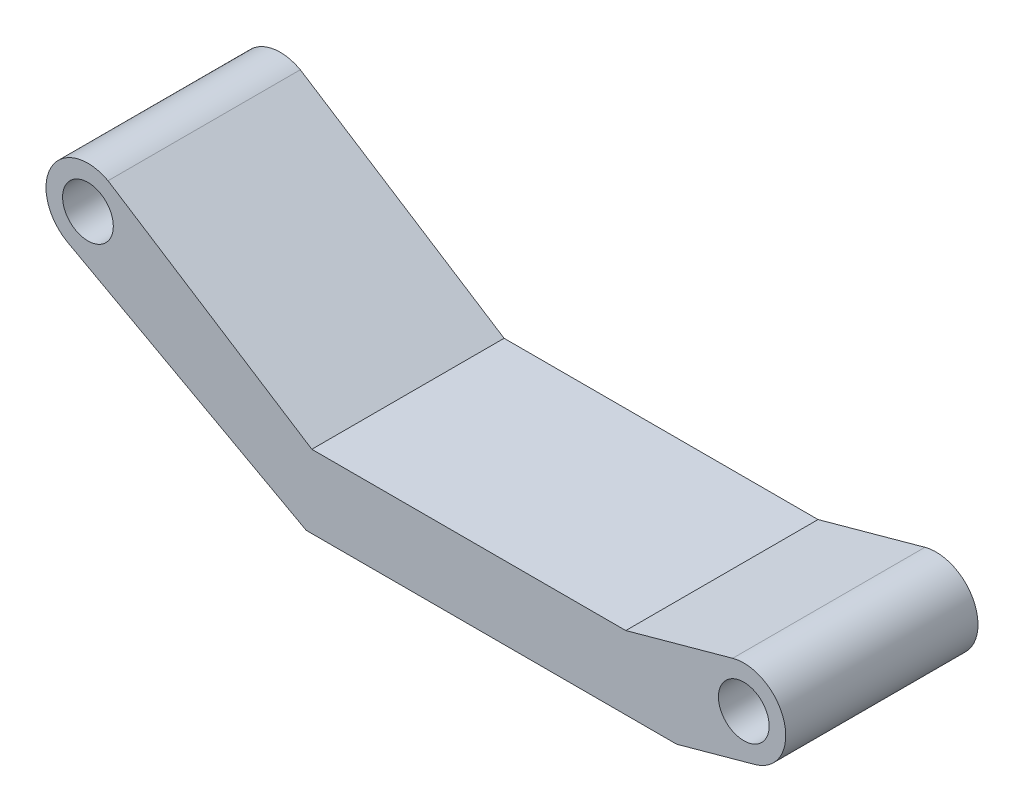
ISO-10303-21;
HEADER;
FILE_DESCRIPTION(('STEP AP214'),'2;1');
FILE_NAME('part.step','',(''),(''),'','','');
FILE_SCHEMA(('AUTOMOTIVE_DESIGN { 1 0 10303 214 1 1 1 1 }'));
ENDSEC;
DATA;
#1=APPLICATION_CONTEXT('core data for automotive mechanical design processes');
#2=APPLICATION_PROTOCOL_DEFINITION('international standard','automotive_design',2000,#1);
#3=PRODUCT_CONTEXT('',#1,'mechanical');
#4=PRODUCT('Part','Part','',(#3));
#5=PRODUCT_RELATED_PRODUCT_CATEGORY('part','',(#4));
#6=PRODUCT_DEFINITION_FORMATION('','',#4);
#7=PRODUCT_DEFINITION_CONTEXT('part definition',#1,'design');
#8=PRODUCT_DEFINITION('design','',#6,#7);
#9=PRODUCT_DEFINITION_SHAPE('','',#8);
#10=(LENGTH_UNIT() NAMED_UNIT(*) SI_UNIT(.MILLI.,.METRE.));
#11=(NAMED_UNIT(*) PLANE_ANGLE_UNIT() SI_UNIT($,.RADIAN.));
#12=(NAMED_UNIT(*) SI_UNIT($,.STERADIAN.) SOLID_ANGLE_UNIT());
#13=UNCERTAINTY_MEASURE_WITH_UNIT(LENGTH_MEASURE(1.E-05),#10,'distance_accuracy_value','');
#14=(GEOMETRIC_REPRESENTATION_CONTEXT(3) GLOBAL_UNCERTAINTY_ASSIGNED_CONTEXT((#13)) GLOBAL_UNIT_ASSIGNED_CONTEXT((#10,
#11,#12)) REPRESENTATION_CONTEXT('',''));
#15=CARTESIAN_POINT('',(0.,0.,0.));
#16=DIRECTION('',(0.,0.,1.));
#17=DIRECTION('',(1.,0.,0.));
#18=AXIS2_PLACEMENT_3D('',#15,#16,#17);
#19=CARTESIAN_POINT('',(-123.808315196469,15.,27.5));
#20=DIRECTION('',(0.,0.,1.));
#21=DIRECTION('',(1.,0.,0.));
#22=AXIS2_PLACEMENT_3D('',#19,#20,#21);
#23=PLANE('',#22);
#24=CARTESIAN_POINT('',(-123.808315196469,15.,27.5));
#25=DIRECTION('',(0.,0.,1.));
#26=DIRECTION('',(1.,0.,0.));
#27=AXIS2_PLACEMENT_3D('',#24,#25,#26);
#28=CIRCLE('',#27,3.62850408907859);
#29=CARTESIAN_POINT('',(-120.17981110739,15.,27.5));
#30=VERTEX_POINT('',#29);
#31=EDGE_CURVE('E142',#30,#30,#28,.T.);
#32=ORIENTED_EDGE('',*,*,#31,.F.);
#33=EDGE_LOOP('',(#32));
#34=FACE_BOUND('',#33,.T.);
#35=CARTESIAN_POINT('',(-123.808315196469,15.,27.5));
#36=DIRECTION('',(0.,0.,1.));
#37=DIRECTION('',(1.,0.,0.));
#38=AXIS2_PLACEMENT_3D('',#35,#36,#37);
#39=CIRCLE('',#38,6.);
#40=CARTESIAN_POINT('',(-120.934685686301,20.2670915540072,27.5));
#41=VERTEX_POINT('',#40);
#42=CARTESIAN_POINT('',(-126.681944706636,9.73290844599282,27.5));
#43=VERTEX_POINT('',#42);
#44=EDGE_CURVE('E153',#41,#43,#39,.T.);
#45=ORIENTED_EDGE('',*,*,#44,.T.);
#46=DIRECTION('',(0.877848592334531,-0.478938251694602,0.));
#47=VECTOR('',#46,1.);
#48=CARTESIAN_POINT('',(-126.681944706636,9.73290844599282,27.5));
#49=LINE('',#48,#47);
#50=CARTESIAN_POINT('',(-92.5887882431829,-8.86769864495569,27.5));
#51=VERTEX_POINT('',#50);
#52=EDGE_CURVE('E101',#43,#51,#49,.T.);
#53=ORIENTED_EDGE('',*,*,#52,.T.);
#54=DIRECTION('',(1.,0.,0.));
#55=VECTOR('',#54,1.);
#56=CARTESIAN_POINT('',(-92.5887882431829,-8.86769864495569,27.5));
#57=LINE('',#56,#55);
#58=CARTESIAN_POINT('',(-39.6075574443592,-8.86769864495569,27.5));
#59=VERTEX_POINT('',#58);
#60=EDGE_CURVE('E168',#51,#59,#57,.T.);
#61=ORIENTED_EDGE('',*,*,#60,.T.);
#62=DIRECTION('',(0.964141980080619,0.265386966986369,0.));
#63=VECTOR('',#62,1.);
#64=CARTESIAN_POINT('',(-39.6075574443592,-8.86769864495569,27.5));
#65=LINE('',#64,#63);
#66=CARTESIAN_POINT('',(-28.4076781980818,-5.78485188048372,27.5));
#67=VERTEX_POINT('',#66);
#68=EDGE_CURVE('E181',#59,#67,#65,.T.);
#69=ORIENTED_EDGE('',*,*,#68,.T.);
#70=CARTESIAN_POINT('',(-30.,0.,27.5));
#71=DIRECTION('',(0.,0.,1.));
#72=DIRECTION('',(1.,0.,0.));
#73=AXIS2_PLACEMENT_3D('',#70,#71,#72);
#74=CIRCLE('',#73,6.);
#75=CARTESIAN_POINT('',(-31.5923218019182,5.78485188048371,27.5));
#76=VERTEX_POINT('',#75);
#77=EDGE_CURVE('E120',#67,#76,#74,.T.);
#78=ORIENTED_EDGE('',*,*,#77,.T.);
#79=DIRECTION('',(-0.964141980080619,-0.265386966986369,0.));
#80=VECTOR('',#79,1.);
#81=CARTESIAN_POINT('',(-46.8797014578034,1.57689143081505,27.5));
#82=LINE('',#81,#80);
#83=CARTESIAN_POINT('',(-46.8797014578034,1.57689143081505,27.5));
#84=VERTEX_POINT('',#83);
#85=EDGE_CURVE('E114',#76,#84,#82,.T.);
#86=ORIENTED_EDGE('',*,*,#85,.T.);
#87=DIRECTION('',(-1.,0.,0.));
#88=VECTOR('',#87,1.);
#89=CARTESIAN_POINT('',(-91.7850438779108,1.57689143081505,27.5));
#90=LINE('',#89,#88);
#91=CARTESIAN_POINT('',(-91.7850438779108,1.57689143081505,27.5));
#92=VERTEX_POINT('',#91);
#93=EDGE_CURVE('E118',#84,#92,#90,.T.);
#94=ORIENTED_EDGE('',*,*,#93,.T.);
#95=DIRECTION('',(-0.841819666427667,0.539758880626906,0.));
#96=VECTOR('',#95,1.);
#97=CARTESIAN_POINT('',(-120.934685686301,20.2670915540072,27.5));
#98=LINE('',#97,#96);
#99=EDGE_CURVE('E58',#92,#41,#98,.T.);
#100=ORIENTED_EDGE('',*,*,#99,.T.);
#101=EDGE_LOOP('',(#45,#53,#61,#69,#78,#86,#94,#100));
#102=FACE_BOUND('',#101,.T.);
#103=CARTESIAN_POINT('',(-30.,0.,27.5));
#104=DIRECTION('',(0.,0.,1.));
#105=DIRECTION('',(1.,0.,0.));
#106=AXIS2_PLACEMENT_3D('',#103,#104,#105);
#107=CIRCLE('',#106,3.62850408907859);
#108=CARTESIAN_POINT('',(-26.3714959109214,0.,27.5));
#109=VERTEX_POINT('',#108);
#110=EDGE_CURVE('E190',#109,#109,#107,.T.);
#111=ORIENTED_EDGE('',*,*,#110,.F.);
#112=EDGE_LOOP('',(#111));
#113=FACE_BOUND('',#112,.T.);
#114=ADVANCED_FACE('F41',(#34,#102,#113),#23,.T.);
#115=CARTESIAN_POINT('',(-123.808315196469,15.,0.));
#116=DIRECTION('',(0.,0.,1.));
#117=DIRECTION('',(1.,0.,0.));
#118=AXIS2_PLACEMENT_3D('',#115,#116,#117);
#119=PLANE('',#118);
#120=CARTESIAN_POINT('',(-123.808315196469,15.,0.));
#121=DIRECTION('',(0.,0.,1.));
#122=DIRECTION('',(1.,0.,0.));
#123=AXIS2_PLACEMENT_3D('',#120,#121,#122);
#124=CIRCLE('',#123,6.);
#125=CARTESIAN_POINT('',(-120.934685686301,20.2670915540072,0.));
#126=VERTEX_POINT('',#125);
#127=CARTESIAN_POINT('',(-126.681944706636,9.73290844599282,0.));
#128=VERTEX_POINT('',#127);
#129=EDGE_CURVE('E138',#126,#128,#124,.T.);
#130=ORIENTED_EDGE('',*,*,#129,.F.);
#131=DIRECTION('',(-0.841819666427667,0.539758880626906,0.));
#132=VECTOR('',#131,1.);
#133=CARTESIAN_POINT('',(-120.934685686301,20.2670915540072,0.));
#134=LINE('',#133,#132);
#135=CARTESIAN_POINT('',(-91.7850438779108,1.57689143081505,0.));
#136=VERTEX_POINT('',#135);
#137=EDGE_CURVE('E93',#136,#126,#134,.T.);
#138=ORIENTED_EDGE('',*,*,#137,.F.);
#139=DIRECTION('',(-1.,0.,0.));
#140=VECTOR('',#139,1.);
#141=CARTESIAN_POINT('',(-91.7850438779108,1.57689143081505,0.));
#142=LINE('',#141,#140);
#143=CARTESIAN_POINT('',(-46.8797014578034,1.57689143081505,0.));
#144=VERTEX_POINT('',#143);
#145=EDGE_CURVE('E87',#144,#136,#142,.T.);
#146=ORIENTED_EDGE('',*,*,#145,.F.);
#147=DIRECTION('',(-0.964141980080619,-0.265386966986369,0.));
#148=VECTOR('',#147,1.);
#149=CARTESIAN_POINT('',(-46.8797014578034,1.57689143081505,0.));
#150=LINE('',#149,#148);
#151=CARTESIAN_POINT('',(-31.5923218019182,5.78485188048371,0.));
#152=VERTEX_POINT('',#151);
#153=EDGE_CURVE('E128',#152,#144,#150,.T.);
#154=ORIENTED_EDGE('',*,*,#153,.F.);
#155=CARTESIAN_POINT('',(-30.,0.,0.));
#156=DIRECTION('',(0.,0.,1.));
#157=DIRECTION('',(1.,0.,0.));
#158=AXIS2_PLACEMENT_3D('',#155,#156,#157);
#159=CIRCLE('',#158,6.);
#160=CARTESIAN_POINT('',(-28.4076781980818,-5.78485188048372,0.));
#161=VERTEX_POINT('',#160);
#162=EDGE_CURVE('E148',#161,#152,#159,.T.);
#163=ORIENTED_EDGE('',*,*,#162,.F.);
#164=DIRECTION('',(0.964141980080619,0.265386966986369,0.));
#165=VECTOR('',#164,1.);
#166=CARTESIAN_POINT('',(-39.6075574443592,-8.86769864495569,0.));
#167=LINE('',#166,#165);
#168=CARTESIAN_POINT('',(-39.6075574443592,-8.86769864495569,0.));
#169=VERTEX_POINT('',#168);
#170=EDGE_CURVE('E146',#169,#161,#167,.T.);
#171=ORIENTED_EDGE('',*,*,#170,.F.);
#172=DIRECTION('',(1.,0.,0.));
#173=VECTOR('',#172,1.);
#174=CARTESIAN_POINT('',(-92.5887882431829,-8.86769864495569,0.));
#175=LINE('',#174,#173);
#176=CARTESIAN_POINT('',(-92.5887882431829,-8.86769864495569,0.));
#177=VERTEX_POINT('',#176);
#178=EDGE_CURVE('E144',#177,#169,#175,.T.);
#179=ORIENTED_EDGE('',*,*,#178,.F.);
#180=DIRECTION('',(0.877848592334531,-0.478938251694602,0.));
#181=VECTOR('',#180,1.);
#182=CARTESIAN_POINT('',(-126.681944706636,9.73290844599282,0.));
#183=LINE('',#182,#181);
#184=EDGE_CURVE('E141',#128,#177,#183,.T.);
#185=ORIENTED_EDGE('',*,*,#184,.F.);
#186=EDGE_LOOP('',(#130,#138,#146,#154,#163,#171,#179,#185));
#187=FACE_BOUND('',#186,.T.);
#188=CARTESIAN_POINT('',(-123.808315196469,15.,0.));
#189=DIRECTION('',(0.,0.,1.));
#190=DIRECTION('',(1.,0.,0.));
#191=AXIS2_PLACEMENT_3D('',#188,#189,#190);
#192=CIRCLE('',#191,3.62850408907859);
#193=CARTESIAN_POINT('',(-120.17981110739,15.,0.));
#194=VERTEX_POINT('',#193);
#195=EDGE_CURVE('E187',#194,#194,#192,.T.);
#196=ORIENTED_EDGE('',*,*,#195,.T.);
#197=EDGE_LOOP('',(#196));
#198=FACE_BOUND('',#197,.T.);
#199=CARTESIAN_POINT('',(-30.,0.,0.));
#200=DIRECTION('',(0.,0.,1.));
#201=DIRECTION('',(1.,0.,0.));
#202=AXIS2_PLACEMENT_3D('',#199,#200,#201);
#203=CIRCLE('',#202,3.62850408907859);
#204=CARTESIAN_POINT('',(-26.3714959109214,0.,0.));
#205=VERTEX_POINT('',#204);
#206=EDGE_CURVE('E193',#205,#205,#203,.T.);
#207=ORIENTED_EDGE('',*,*,#206,.T.);
#208=EDGE_LOOP('',(#207));
#209=FACE_BOUND('',#208,.T.);
#210=ADVANCED_FACE('F172',(#187,#198,#209),#119,.F.);
#211=CARTESIAN_POINT('',(-123.808315196469,15.,27.5));
#212=DIRECTION('',(0.,0.,-1.));
#213=DIRECTION('',(-1.,0.,0.));
#214=AXIS2_PLACEMENT_3D('',#211,#212,#213);
#215=CYLINDRICAL_SURFACE('',#214,6.);
#216=ORIENTED_EDGE('',*,*,#129,.T.);
#217=DIRECTION('',(0.,0.,-1.));
#218=VECTOR('',#217,1.);
#219=CARTESIAN_POINT('',(-126.681944706636,9.73290844599282,27.5));
#220=LINE('',#219,#218);
#221=EDGE_CURVE('E11',#43,#128,#220,.T.);
#222=ORIENTED_EDGE('',*,*,#221,.F.);
#223=ORIENTED_EDGE('',*,*,#44,.F.);
#224=DIRECTION('',(0.,0.,-1.));
#225=VECTOR('',#224,1.);
#226=CARTESIAN_POINT('',(-120.934685686301,20.2670915540072,27.5));
#227=LINE('',#226,#225);
#228=EDGE_CURVE('E134',#41,#126,#227,.T.);
#229=ORIENTED_EDGE('',*,*,#228,.T.);
#230=EDGE_LOOP('',(#216,#222,#223,#229));
#231=FACE_BOUND('',#230,.T.);
#232=ADVANCED_FACE('F43',(#231),#215,.T.);
#233=CARTESIAN_POINT('',(-126.681944706636,9.73290844599282,27.5));
#234=DIRECTION('',(0.478938251694602,0.877848592334531,0.));
#235=DIRECTION('',(-0.877848592334531,0.478938251694602,0.));
#236=AXIS2_PLACEMENT_3D('',#233,#234,#235);
#237=PLANE('',#236);
#238=ORIENTED_EDGE('',*,*,#184,.T.);
#239=DIRECTION('',(0.,0.,-1.));
#240=VECTOR('',#239,1.);
#241=CARTESIAN_POINT('',(-92.5887882431829,-8.86769864495569,27.5));
#242=LINE('',#241,#240);
#243=EDGE_CURVE('E50',#51,#177,#242,.T.);
#244=ORIENTED_EDGE('',*,*,#243,.F.);
#245=ORIENTED_EDGE('',*,*,#52,.F.);
#246=ORIENTED_EDGE('',*,*,#221,.T.);
#247=EDGE_LOOP('',(#238,#244,#245,#246));
#248=FACE_BOUND('',#247,.T.);
#249=ADVANCED_FACE('F226',(#248),#237,.F.);
#250=CARTESIAN_POINT('',(-92.5887882431829,-8.86769864495569,27.5));
#251=DIRECTION('',(0.,1.,0.));
#252=DIRECTION('',(0.,0.,1.));
#253=AXIS2_PLACEMENT_3D('',#250,#251,#252);
#254=PLANE('',#253);
#255=ORIENTED_EDGE('',*,*,#178,.T.);
#256=DIRECTION('',(0.,0.,-1.));
#257=VECTOR('',#256,1.);
#258=CARTESIAN_POINT('',(-39.6075574443592,-8.86769864495569,27.5));
#259=LINE('',#258,#257);
#260=EDGE_CURVE('E160',#59,#169,#259,.T.);
#261=ORIENTED_EDGE('',*,*,#260,.F.);
#262=ORIENTED_EDGE('',*,*,#60,.F.);
#263=ORIENTED_EDGE('',*,*,#243,.T.);
#264=EDGE_LOOP('',(#255,#261,#262,#263));
#265=FACE_BOUND('',#264,.T.);
#266=ADVANCED_FACE('F166',(#265),#254,.F.);
#267=CARTESIAN_POINT('',(-39.6075574443592,-8.86769864495569,27.5));
#268=DIRECTION('',(-0.265386966986369,0.964141980080619,0.));
#269=DIRECTION('',(-0.964141980080619,-0.265386966986369,0.));
#270=AXIS2_PLACEMENT_3D('',#267,#268,#269);
#271=PLANE('',#270);
#272=ORIENTED_EDGE('',*,*,#170,.T.);
#273=DIRECTION('',(0.,0.,-1.));
#274=VECTOR('',#273,1.);
#275=CARTESIAN_POINT('',(-28.4076781980818,-5.78485188048372,27.5));
#276=LINE('',#275,#274);
#277=EDGE_CURVE('E157',#67,#161,#276,.T.);
#278=ORIENTED_EDGE('',*,*,#277,.F.);
#279=ORIENTED_EDGE('',*,*,#68,.F.);
#280=ORIENTED_EDGE('',*,*,#260,.T.);
#281=EDGE_LOOP('',(#272,#278,#279,#280));
#282=FACE_BOUND('',#281,.T.);
#283=ADVANCED_FACE('F177',(#282),#271,.F.);
#284=CARTESIAN_POINT('',(-30.,0.,27.5));
#285=DIRECTION('',(0.,0.,-1.));
#286=DIRECTION('',(-1.,0.,0.));
#287=AXIS2_PLACEMENT_3D('',#284,#285,#286);
#288=CYLINDRICAL_SURFACE('',#287,6.);
#289=ORIENTED_EDGE('',*,*,#162,.T.);
#290=DIRECTION('',(0.,0.,-1.));
#291=VECTOR('',#290,1.);
#292=CARTESIAN_POINT('',(-31.5923218019182,5.78485188048371,27.5));
#293=LINE('',#292,#291);
#294=EDGE_CURVE('E129',#76,#152,#293,.T.);
#295=ORIENTED_EDGE('',*,*,#294,.F.);
#296=ORIENTED_EDGE('',*,*,#77,.F.);
#297=ORIENTED_EDGE('',*,*,#277,.T.);
#298=EDGE_LOOP('',(#289,#295,#296,#297));
#299=FACE_BOUND('',#298,.T.);
#300=ADVANCED_FACE('F180',(#299),#288,.T.);
#301=CARTESIAN_POINT('',(-46.8797014578034,1.57689143081505,27.5));
#302=DIRECTION('',(0.265386966986369,-0.964141980080619,0.));
#303=DIRECTION('',(0.964141980080619,0.265386966986369,0.));
#304=AXIS2_PLACEMENT_3D('',#301,#302,#303);
#305=PLANE('',#304);
#306=ORIENTED_EDGE('',*,*,#153,.T.);
#307=DIRECTION('',(0.,0.,-1.));
#308=VECTOR('',#307,1.);
#309=CARTESIAN_POINT('',(-46.8797014578034,1.57689143081505,27.5));
#310=LINE('',#309,#308);
#311=EDGE_CURVE('E125',#84,#144,#310,.T.);
#312=ORIENTED_EDGE('',*,*,#311,.F.);
#313=ORIENTED_EDGE('',*,*,#85,.F.);
#314=ORIENTED_EDGE('',*,*,#294,.T.);
#315=EDGE_LOOP('',(#306,#312,#313,#314));
#316=FACE_BOUND('',#315,.T.);
#317=ADVANCED_FACE('F126',(#316),#305,.F.);
#318=CARTESIAN_POINT('',(-91.7850438779108,1.57689143081505,27.5));
#319=DIRECTION('',(0.,-1.,0.));
#320=DIRECTION('',(0.,0.,-1.));
#321=AXIS2_PLACEMENT_3D('',#318,#319,#320);
#322=PLANE('',#321);
#323=ORIENTED_EDGE('',*,*,#145,.T.);
#324=DIRECTION('',(0.,0.,-1.));
#325=VECTOR('',#324,1.);
#326=CARTESIAN_POINT('',(-91.7850438779108,1.57689143081505,27.5));
#327=LINE('',#326,#325);
#328=EDGE_CURVE('E130',#92,#136,#327,.T.);
#329=ORIENTED_EDGE('',*,*,#328,.F.);
#330=ORIENTED_EDGE('',*,*,#93,.F.);
#331=ORIENTED_EDGE('',*,*,#311,.T.);
#332=EDGE_LOOP('',(#323,#329,#330,#331));
#333=FACE_BOUND('',#332,.T.);
#334=ADVANCED_FACE('F132',(#333),#322,.F.);
#335=CARTESIAN_POINT('',(-120.934685686301,20.2670915540072,27.5));
#336=DIRECTION('',(-0.539758880626906,-0.841819666427667,0.));
#337=DIRECTION('',(0.841819666427667,-0.539758880626906,0.));
#338=AXIS2_PLACEMENT_3D('',#335,#336,#337);
#339=PLANE('',#338);
#340=ORIENTED_EDGE('',*,*,#137,.T.);
#341=ORIENTED_EDGE('',*,*,#228,.F.);
#342=ORIENTED_EDGE('',*,*,#99,.F.);
#343=ORIENTED_EDGE('',*,*,#328,.T.);
#344=EDGE_LOOP('',(#340,#341,#342,#343));
#345=FACE_BOUND('',#344,.T.);
#346=ADVANCED_FACE('F214',(#345),#339,.F.);
#347=CARTESIAN_POINT('',(-123.808315196469,15.,27.5));
#348=DIRECTION('',(0.,0.,-1.));
#349=DIRECTION('',(-1.,0.,0.));
#350=AXIS2_PLACEMENT_3D('',#347,#348,#349);
#351=CYLINDRICAL_SURFACE('',#350,3.62850408907859);
#352=ORIENTED_EDGE('',*,*,#31,.T.);
#353=EDGE_LOOP('',(#352));
#354=FACE_BOUND('',#353,.T.);
#355=ORIENTED_EDGE('',*,*,#195,.F.);
#356=EDGE_LOOP('',(#355));
#357=FACE_BOUND('',#356,.T.);
#358=ADVANCED_FACE('F211',(#354,#357),#351,.F.);
#359=CARTESIAN_POINT('',(-30.,0.,27.5));
#360=DIRECTION('',(0.,0.,-1.));
#361=DIRECTION('',(-1.,0.,0.));
#362=AXIS2_PLACEMENT_3D('',#359,#360,#361);
#363=CYLINDRICAL_SURFACE('',#362,3.62850408907859);
#364=ORIENTED_EDGE('',*,*,#110,.T.);
#365=EDGE_LOOP('',(#364));
#366=FACE_BOUND('',#365,.T.);
#367=ORIENTED_EDGE('',*,*,#206,.F.);
#368=EDGE_LOOP('',(#367));
#369=FACE_BOUND('',#368,.T.);
#370=ADVANCED_FACE('F199',(#366,#369),#363,.F.);
#371=CLOSED_SHELL('',(#114,#210,#232,#249,#266,#283,#300,#317,#334,#346,#358,#370));
#372=MANIFOLD_SOLID_BREP('B2',#371);
#373=ADVANCED_BREP_SHAPE_REPRESENTATION('',(#18,#372),#14);
#374=SHAPE_DEFINITION_REPRESENTATION(#9,#373);
ENDSEC;
END-ISO-10303-21;
